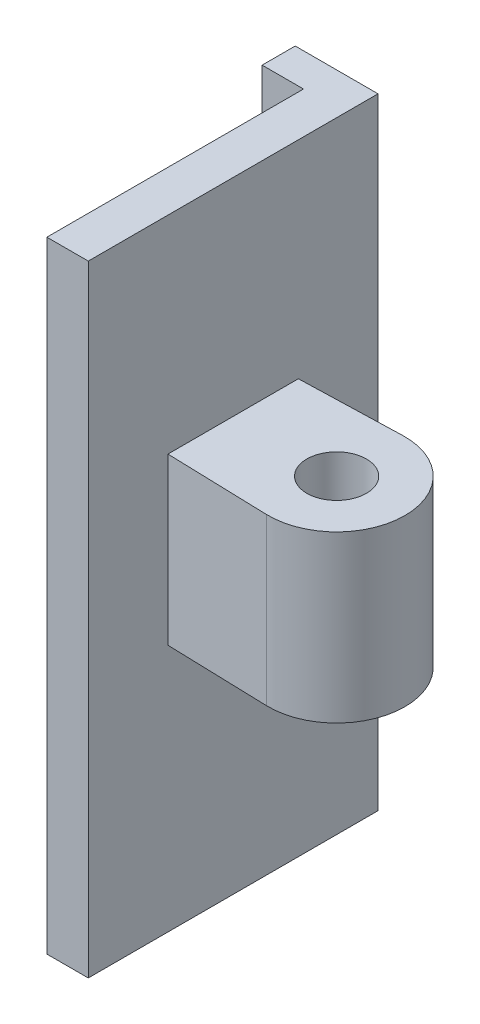
ISO-10303-21;
HEADER;
FILE_DESCRIPTION(('STEP AP214'),'2;1');
FILE_NAME('part.step','',(''),(''),'','','');
FILE_SCHEMA(('AUTOMOTIVE_DESIGN { 1 0 10303 214 1 1 1 1 }'));
ENDSEC;
DATA;
#1=APPLICATION_CONTEXT('core data for automotive mechanical design processes');
#2=APPLICATION_PROTOCOL_DEFINITION('international standard','automotive_design',2000,#1);
#3=PRODUCT_CONTEXT('',#1,'mechanical');
#4=PRODUCT('Part','Part','',(#3));
#5=PRODUCT_RELATED_PRODUCT_CATEGORY('part','',(#4));
#6=PRODUCT_DEFINITION_FORMATION('','',#4);
#7=PRODUCT_DEFINITION_CONTEXT('part definition',#1,'design');
#8=PRODUCT_DEFINITION('design','',#6,#7);
#9=PRODUCT_DEFINITION_SHAPE('','',#8);
#10=(LENGTH_UNIT() NAMED_UNIT(*) SI_UNIT(.MILLI.,.METRE.));
#11=(NAMED_UNIT(*) PLANE_ANGLE_UNIT() SI_UNIT($,.RADIAN.));
#12=(NAMED_UNIT(*) SI_UNIT($,.STERADIAN.) SOLID_ANGLE_UNIT());
#13=UNCERTAINTY_MEASURE_WITH_UNIT(LENGTH_MEASURE(1.E-05),#10,'distance_accuracy_value','');
#14=(GEOMETRIC_REPRESENTATION_CONTEXT(3) GLOBAL_UNCERTAINTY_ASSIGNED_CONTEXT((#13)) GLOBAL_UNIT_ASSIGNED_CONTEXT((#10,
#11,#12)) REPRESENTATION_CONTEXT('',''));
#15=CARTESIAN_POINT('',(0.,0.,0.));
#16=DIRECTION('',(0.,0.,1.));
#17=DIRECTION('',(1.,0.,0.));
#18=AXIS2_PLACEMENT_3D('',#15,#16,#17);
#19=CARTESIAN_POINT('',(2.5,-8.25,0.));
#20=DIRECTION('',(0.,-1.,0.));
#21=DIRECTION('',(0.,0.,-1.));
#22=AXIS2_PLACEMENT_3D('',#19,#20,#21);
#23=CYLINDRICAL_SURFACE('',#22,0.36);
#24=CARTESIAN_POINT('',(2.5,-8.25,0.));
#25=DIRECTION('',(0.,1.,0.));
#26=DIRECTION('',(0.,0.,1.));
#27=AXIS2_PLACEMENT_3D('',#24,#25,#26);
#28=CIRCLE('',#27,0.36);
#29=CARTESIAN_POINT('',(2.5,-8.25,0.360000000000001));
#30=VERTEX_POINT('',#29);
#31=EDGE_CURVE('E184',#30,#30,#28,.T.);
#32=ORIENTED_EDGE('',*,*,#31,.T.);
#33=EDGE_LOOP('',(#32));
#34=FACE_BOUND('',#33,.T.);
#35=CARTESIAN_POINT('',(2.5,-9.65,0.));
#36=DIRECTION('',(0.,-1.,0.));
#37=DIRECTION('',(0.,0.,-1.));
#38=AXIS2_PLACEMENT_3D('',#35,#36,#37);
#39=CIRCLE('',#38,0.36);
#40=CARTESIAN_POINT('',(2.5,-9.65,-0.359999999999999));
#41=VERTEX_POINT('',#40);
#42=EDGE_CURVE('E43',#41,#41,#39,.T.);
#43=ORIENTED_EDGE('',*,*,#42,.T.);
#44=EDGE_LOOP('',(#43));
#45=FACE_BOUND('',#44,.T.);
#46=ADVANCED_FACE('F39',(#34,#45),#23,.F.);
#47=CARTESIAN_POINT('',(0.750000000000001,-8.25,1.75));
#48=DIRECTION('',(1.,0.,0.));
#49=DIRECTION('',(0.,0.,-1.));
#50=AXIS2_PLACEMENT_3D('',#47,#48,#49);
#51=PLANE('',#50);
#52=DIRECTION('',(0.,1.,0.));
#53=VECTOR('',#52,1.);
#54=CARTESIAN_POINT('',(0.750000000000001,-5.75,-1.35));
#55=LINE('',#54,#53);
#56=CARTESIAN_POINT('',(0.750000000000001,-13.25,-1.35));
#57=VERTEX_POINT('',#56);
#58=CARTESIAN_POINT('',(0.750000000000001,-5.75,-1.35));
#59=VERTEX_POINT('',#58);
#60=EDGE_CURVE('E55',#57,#59,#55,.T.);
#61=ORIENTED_EDGE('',*,*,#60,.F.);
#62=DIRECTION('',(0.,0.,1.));
#63=VECTOR('',#62,1.);
#64=CARTESIAN_POINT('',(0.750000000000001,-13.25,-1.75));
#65=LINE('',#64,#63);
#66=CARTESIAN_POINT('',(0.750000000000001,-13.25,1.75));
#67=VERTEX_POINT('',#66);
#68=EDGE_CURVE('E169',#57,#67,#65,.T.);
#69=ORIENTED_EDGE('',*,*,#68,.T.);
#70=DIRECTION('',(0.,-1.,0.));
#71=VECTOR('',#70,1.);
#72=CARTESIAN_POINT('',(0.750000000000001,-8.25,1.75));
#73=LINE('',#72,#71);
#74=CARTESIAN_POINT('',(0.750000000000001,-5.75,1.75));
#75=VERTEX_POINT('',#74);
#76=EDGE_CURVE('E204',#75,#67,#73,.T.);
#77=ORIENTED_EDGE('',*,*,#76,.F.);
#78=DIRECTION('',(0.,0.,1.));
#79=VECTOR('',#78,1.);
#80=CARTESIAN_POINT('',(0.750000000000001,-5.75,-1.75));
#81=LINE('',#80,#79);
#82=EDGE_CURVE('E164',#59,#75,#81,.T.);
#83=ORIENTED_EDGE('',*,*,#82,.F.);
#84=EDGE_LOOP('',(#61,#69,#77,#83));
#85=FACE_BOUND('',#84,.T.);
#86=ADVANCED_FACE('F235',(#85),#51,.F.);
#87=CARTESIAN_POINT('',(2.5,-8.25,0.));
#88=DIRECTION('',(0.,1.,0.));
#89=DIRECTION('',(0.,0.,1.));
#90=AXIS2_PLACEMENT_3D('',#87,#88,#89);
#91=PLANE('',#90);
#92=DIRECTION('',(0.,0.,-1.));
#93=VECTOR('',#92,1.);
#94=CARTESIAN_POINT('',(1.25,-8.25,0.));
#95=LINE('',#94,#93);
#96=CARTESIAN_POINT('',(1.25,-8.25,0.78768744273324));
#97=VERTEX_POINT('',#96);
#98=CARTESIAN_POINT('',(1.25,-8.25,-0.787687442733241));
#99=VERTEX_POINT('',#98);
#100=EDGE_CURVE('E181',#97,#99,#95,.T.);
#101=ORIENTED_EDGE('',*,*,#100,.F.);
#102=DIRECTION('',(0.99954579976556,0.,0.0301362600703332));
#103=VECTOR('',#102,1.);
#104=CARTESIAN_POINT('',(2.47513758544198,-8.25,0.824625284806589));
#105=LINE('',#104,#103);
#106=CARTESIAN_POINT('',(2.47513758544198,-8.25,0.824625284806589));
#107=VERTEX_POINT('',#106);
#108=EDGE_CURVE('E64',#97,#107,#105,.T.);
#109=ORIENTED_EDGE('',*,*,#108,.T.);
#110=CARTESIAN_POINT('',(2.5,-8.25,0.));
#111=DIRECTION('',(0.,1.,0.));
#112=DIRECTION('',(0.,0.,1.));
#113=AXIS2_PLACEMENT_3D('',#110,#111,#112);
#114=CIRCLE('',#113,0.825000000000001);
#115=CARTESIAN_POINT('',(2.47513758544198,-8.25,-0.824625284806588));
#116=VERTEX_POINT('',#115);
#117=EDGE_CURVE('E188',#107,#116,#114,.T.);
#118=ORIENTED_EDGE('',*,*,#117,.T.);
#119=DIRECTION('',(-0.99954579976556,0.,0.0301362600703313));
#120=VECTOR('',#119,1.);
#121=CARTESIAN_POINT('',(1.25,-8.25,-0.787687442733241));
#122=LINE('',#121,#120);
#123=EDGE_CURVE('E86',#116,#99,#122,.T.);
#124=ORIENTED_EDGE('',*,*,#123,.T.);
#125=EDGE_LOOP('',(#101,#109,#118,#124));
#126=FACE_BOUND('',#125,.T.);
#127=ORIENTED_EDGE('',*,*,#31,.F.);
#128=EDGE_LOOP('',(#127));
#129=FACE_BOUND('',#128,.T.);
#130=ADVANCED_FACE('F243',(#126,#129),#91,.T.);
#131=CARTESIAN_POINT('',(2.5,-10.25,0.));
#132=DIRECTION('',(0.,1.,0.));
#133=DIRECTION('',(0.,0.,1.));
#134=AXIS2_PLACEMENT_3D('',#131,#132,#133);
#135=PLANE('',#134);
#136=CARTESIAN_POINT('',(2.5,-10.25,0.));
#137=DIRECTION('',(0.,-1.,0.));
#138=DIRECTION('',(0.,0.,-1.));
#139=AXIS2_PLACEMENT_3D('',#136,#137,#138);
#140=CIRCLE('',#139,0.45);
#141=CARTESIAN_POINT('',(2.5,-10.25,-0.449999999999999));
#142=VERTEX_POINT('',#141);
#143=EDGE_CURVE('E155',#142,#142,#140,.T.);
#144=ORIENTED_EDGE('',*,*,#143,.F.);
#145=EDGE_LOOP('',(#144));
#146=FACE_BOUND('',#145,.T.);
#147=DIRECTION('',(0.99954579976556,0.,0.0301362600703332));
#148=VECTOR('',#147,1.);
#149=CARTESIAN_POINT('',(2.47513758544198,-10.25,0.824625284806589));
#150=LINE('',#149,#148);
#151=CARTESIAN_POINT('',(1.25,-10.25,0.78768744273324));
#152=VERTEX_POINT('',#151);
#153=CARTESIAN_POINT('',(2.47513758544198,-10.25,0.824625284806589));
#154=VERTEX_POINT('',#153);
#155=EDGE_CURVE('E79',#152,#154,#150,.T.);
#156=ORIENTED_EDGE('',*,*,#155,.F.);
#157=DIRECTION('',(0.,0.,-1.));
#158=VECTOR('',#157,1.);
#159=CARTESIAN_POINT('',(1.25,-10.25,0.));
#160=LINE('',#159,#158);
#161=CARTESIAN_POINT('',(1.25,-10.25,-0.787687442733241));
#162=VERTEX_POINT('',#161);
#163=EDGE_CURVE('E179',#152,#162,#160,.T.);
#164=ORIENTED_EDGE('',*,*,#163,.T.);
#165=DIRECTION('',(-0.99954579976556,0.,0.0301362600703313));
#166=VECTOR('',#165,1.);
#167=CARTESIAN_POINT('',(1.25,-10.25,-0.787687442733241));
#168=LINE('',#167,#166);
#169=CARTESIAN_POINT('',(2.47513758544198,-10.25,-0.824625284806588));
#170=VERTEX_POINT('',#169);
#171=EDGE_CURVE('E195',#170,#162,#168,.T.);
#172=ORIENTED_EDGE('',*,*,#171,.F.);
#173=CARTESIAN_POINT('',(2.5,-10.25,0.));
#174=DIRECTION('',(0.,1.,0.));
#175=DIRECTION('',(0.,0.,1.));
#176=AXIS2_PLACEMENT_3D('',#173,#174,#175);
#177=CIRCLE('',#176,0.825000000000001);
#178=EDGE_CURVE('E187',#154,#170,#177,.T.);
#179=ORIENTED_EDGE('',*,*,#178,.F.);
#180=EDGE_LOOP('',(#156,#164,#172,#179));
#181=FACE_BOUND('',#180,.T.);
#182=ADVANCED_FACE('F217',(#146,#181),#135,.F.);
#183=CARTESIAN_POINT('',(2.5,-8.25,0.));
#184=DIRECTION('',(0.,-1.,0.));
#185=DIRECTION('',(0.,0.,-1.));
#186=AXIS2_PLACEMENT_3D('',#183,#184,#185);
#187=CYLINDRICAL_SURFACE('',#186,0.825000000000001);
#188=ORIENTED_EDGE('',*,*,#178,.T.);
#189=DIRECTION('',(0.,-1.,0.));
#190=VECTOR('',#189,1.);
#191=CARTESIAN_POINT('',(2.47513758544198,-8.25,-0.824625284806588));
#192=LINE('',#191,#190);
#193=EDGE_CURVE('E11',#116,#170,#192,.T.);
#194=ORIENTED_EDGE('',*,*,#193,.F.);
#195=ORIENTED_EDGE('',*,*,#117,.F.);
#196=DIRECTION('',(0.,-1.,0.));
#197=VECTOR('',#196,1.);
#198=CARTESIAN_POINT('',(2.47513758544198,-8.25,0.824625284806589));
#199=LINE('',#198,#197);
#200=EDGE_CURVE('E192',#107,#154,#199,.T.);
#201=ORIENTED_EDGE('',*,*,#200,.T.);
#202=EDGE_LOOP('',(#188,#194,#195,#201));
#203=FACE_BOUND('',#202,.T.);
#204=ADVANCED_FACE('F41',(#203),#187,.T.);
#205=CARTESIAN_POINT('',(1.25,-8.25,-0.787687442733241));
#206=DIRECTION('',(0.0301362600703313,0.,0.99954579976556));
#207=DIRECTION('',(0.99954579976556,0.,-0.0301362600703313));
#208=AXIS2_PLACEMENT_3D('',#205,#206,#207);
#209=PLANE('',#208);
#210=ORIENTED_EDGE('',*,*,#171,.T.);
#211=DIRECTION('',(0.,-1.,0.));
#212=VECTOR('',#211,1.);
#213=CARTESIAN_POINT('',(1.25,-8.25,-0.787687442733241));
#214=LINE('',#213,#212);
#215=EDGE_CURVE('E48',#99,#162,#214,.T.);
#216=ORIENTED_EDGE('',*,*,#215,.F.);
#217=ORIENTED_EDGE('',*,*,#123,.F.);
#218=ORIENTED_EDGE('',*,*,#193,.T.);
#219=EDGE_LOOP('',(#210,#216,#217,#218));
#220=FACE_BOUND('',#219,.T.);
#221=ADVANCED_FACE('F213',(#220),#209,.F.);
#222=CARTESIAN_POINT('',(0.750000000000001,-8.25,-1.75));
#223=DIRECTION('',(0.,0.,1.));
#224=DIRECTION('',(1.,0.,0.));
#225=AXIS2_PLACEMENT_3D('',#222,#223,#224);
#226=PLANE('',#225);
#227=DIRECTION('',(0.,-1.,0.));
#228=VECTOR('',#227,1.);
#229=CARTESIAN_POINT('',(1.25,-8.25,-1.75));
#230=LINE('',#229,#228);
#231=CARTESIAN_POINT('',(1.25,-5.75,-1.75));
#232=VERTEX_POINT('',#231);
#233=CARTESIAN_POINT('',(1.25,-13.25,-1.75));
#234=VERTEX_POINT('',#233);
#235=EDGE_CURVE('E132',#232,#234,#230,.T.);
#236=ORIENTED_EDGE('',*,*,#235,.T.);
#237=DIRECTION('',(-1.,0.,0.));
#238=VECTOR('',#237,1.);
#239=CARTESIAN_POINT('',(1.25,-13.25,-1.75));
#240=LINE('',#239,#238);
#241=CARTESIAN_POINT('',(0.250000000000001,-13.25,-1.75));
#242=VERTEX_POINT('',#241);
#243=EDGE_CURVE('E126',#234,#242,#240,.T.);
#244=ORIENTED_EDGE('',*,*,#243,.T.);
#245=DIRECTION('',(0.,-1.,0.));
#246=VECTOR('',#245,1.);
#247=CARTESIAN_POINT('',(0.250000000000001,-5.75,-1.75));
#248=LINE('',#247,#246);
#249=CARTESIAN_POINT('',(0.250000000000001,-5.75,-1.75));
#250=VERTEX_POINT('',#249);
#251=EDGE_CURVE('E131',#250,#242,#248,.T.);
#252=ORIENTED_EDGE('',*,*,#251,.F.);
#253=DIRECTION('',(-1.,0.,0.));
#254=VECTOR('',#253,1.);
#255=CARTESIAN_POINT('',(1.25,-5.75,-1.75));
#256=LINE('',#255,#254);
#257=EDGE_CURVE('E137',#232,#250,#256,.T.);
#258=ORIENTED_EDGE('',*,*,#257,.F.);
#259=EDGE_LOOP('',(#236,#244,#252,#258));
#260=FACE_BOUND('',#259,.T.);
#261=ADVANCED_FACE('F128',(#260),#226,.F.);
#262=CARTESIAN_POINT('',(1.25,-8.25,1.75));
#263=DIRECTION('',(0.,0.,-1.));
#264=DIRECTION('',(-1.,0.,0.));
#265=AXIS2_PLACEMENT_3D('',#262,#263,#264);
#266=PLANE('',#265);
#267=ORIENTED_EDGE('',*,*,#76,.T.);
#268=DIRECTION('',(-1.,0.,0.));
#269=VECTOR('',#268,1.);
#270=CARTESIAN_POINT('',(1.25,-13.25,1.75));
#271=LINE('',#270,#269);
#272=CARTESIAN_POINT('',(1.25,-13.25,1.75));
#273=VERTEX_POINT('',#272);
#274=EDGE_CURVE('E136',#273,#67,#271,.T.);
#275=ORIENTED_EDGE('',*,*,#274,.F.);
#276=DIRECTION('',(0.,-1.,0.));
#277=VECTOR('',#276,1.);
#278=CARTESIAN_POINT('',(1.25,-8.25,1.75));
#279=LINE('',#278,#277);
#280=CARTESIAN_POINT('',(1.25,-5.75,1.75));
#281=VERTEX_POINT('',#280);
#282=EDGE_CURVE('E202',#281,#273,#279,.T.);
#283=ORIENTED_EDGE('',*,*,#282,.F.);
#284=DIRECTION('',(-1.,0.,0.));
#285=VECTOR('',#284,1.);
#286=CARTESIAN_POINT('',(1.25,-5.75,1.75));
#287=LINE('',#286,#285);
#288=EDGE_CURVE('E176',#281,#75,#287,.T.);
#289=ORIENTED_EDGE('',*,*,#288,.T.);
#290=EDGE_LOOP('',(#267,#275,#283,#289));
#291=FACE_BOUND('',#290,.T.);
#292=ADVANCED_FACE('F231',(#291),#266,.F.);
#293=CARTESIAN_POINT('',(1.25,-8.25,0.78768744273324));
#294=DIRECTION('',(-1.,0.,0.));
#295=DIRECTION('',(0.,0.,1.));
#296=AXIS2_PLACEMENT_3D('',#293,#294,#295);
#297=PLANE('',#296);
#298=DIRECTION('',(0.,-1.,0.));
#299=VECTOR('',#298,1.);
#300=CARTESIAN_POINT('',(1.25,-8.25,0.78768744273324));
#301=LINE('',#300,#299);
#302=EDGE_CURVE('E200',#97,#152,#301,.T.);
#303=ORIENTED_EDGE('',*,*,#302,.F.);
#304=ORIENTED_EDGE('',*,*,#100,.T.);
#305=ORIENTED_EDGE('',*,*,#215,.T.);
#306=ORIENTED_EDGE('',*,*,#163,.F.);
#307=EDGE_LOOP('',(#303,#304,#305,#306));
#308=FACE_BOUND('',#307,.T.);
#309=ORIENTED_EDGE('',*,*,#282,.T.);
#310=DIRECTION('',(0.,0.,1.));
#311=VECTOR('',#310,1.);
#312=CARTESIAN_POINT('',(1.25,-13.25,-1.75));
#313=LINE('',#312,#311);
#314=EDGE_CURVE('E168',#234,#273,#313,.T.);
#315=ORIENTED_EDGE('',*,*,#314,.F.);
#316=ORIENTED_EDGE('',*,*,#235,.F.);
#317=DIRECTION('',(0.,0.,1.));
#318=VECTOR('',#317,1.);
#319=CARTESIAN_POINT('',(1.25,-5.75,-1.75));
#320=LINE('',#319,#318);
#321=EDGE_CURVE('E165',#232,#281,#320,.T.);
#322=ORIENTED_EDGE('',*,*,#321,.T.);
#323=EDGE_LOOP('',(#309,#315,#316,#322));
#324=FACE_BOUND('',#323,.T.);
#325=ADVANCED_FACE('F211',(#308,#324),#297,.F.);
#326=CARTESIAN_POINT('',(2.47513758544198,-8.25,0.824625284806589));
#327=DIRECTION('',(0.0301362600703332,0.,-0.99954579976556));
#328=DIRECTION('',(-0.99954579976556,0.,-0.0301362600703332));
#329=AXIS2_PLACEMENT_3D('',#326,#327,#328);
#330=PLANE('',#329);
#331=ORIENTED_EDGE('',*,*,#155,.T.);
#332=ORIENTED_EDGE('',*,*,#200,.F.);
#333=ORIENTED_EDGE('',*,*,#108,.F.);
#334=ORIENTED_EDGE('',*,*,#302,.T.);
#335=EDGE_LOOP('',(#331,#332,#333,#334));
#336=FACE_BOUND('',#335,.T.);
#337=ADVANCED_FACE('F220',(#336),#330,.F.);
#338=CARTESIAN_POINT('',(1.25,-13.25,-1.75));
#339=DIRECTION('',(0.,-1.,0.));
#340=DIRECTION('',(1.,0.,0.));
#341=AXIS2_PLACEMENT_3D('',#338,#339,#340);
#342=PLANE('',#341);
#343=ORIENTED_EDGE('',*,*,#68,.F.);
#344=DIRECTION('',(1.,0.,0.));
#345=VECTOR('',#344,1.);
#346=CARTESIAN_POINT('',(0.250000000000001,-13.25,-1.35));
#347=LINE('',#346,#345);
#348=CARTESIAN_POINT('',(0.250000000000001,-13.25,-1.35));
#349=VERTEX_POINT('',#348);
#350=EDGE_CURVE('E143',#349,#57,#347,.T.);
#351=ORIENTED_EDGE('',*,*,#350,.F.);
#352=DIRECTION('',(0.,0.,1.));
#353=VECTOR('',#352,1.);
#354=CARTESIAN_POINT('',(0.250000000000001,-13.25,-1.75));
#355=LINE('',#354,#353);
#356=EDGE_CURVE('E140',#242,#349,#355,.T.);
#357=ORIENTED_EDGE('',*,*,#356,.F.);
#358=ORIENTED_EDGE('',*,*,#243,.F.);
#359=ORIENTED_EDGE('',*,*,#314,.T.);
#360=ORIENTED_EDGE('',*,*,#274,.T.);
#361=EDGE_LOOP('',(#343,#351,#357,#358,#359,#360));
#362=FACE_BOUND('',#361,.T.);
#363=ADVANCED_FACE('F141',(#362),#342,.T.);
#364=CARTESIAN_POINT('',(1.25,-5.75,-1.75));
#365=DIRECTION('',(0.,-1.,0.));
#366=DIRECTION('',(1.,0.,0.));
#367=AXIS2_PLACEMENT_3D('',#364,#365,#366);
#368=PLANE('',#367);
#369=ORIENTED_EDGE('',*,*,#257,.T.);
#370=DIRECTION('',(0.,0.,-1.));
#371=VECTOR('',#370,1.);
#372=CARTESIAN_POINT('',(0.250000000000001,-5.75,-1.75));
#373=LINE('',#372,#371);
#374=CARTESIAN_POINT('',(0.250000000000001,-5.75,-1.35));
#375=VERTEX_POINT('',#374);
#376=EDGE_CURVE('E151',#375,#250,#373,.T.);
#377=ORIENTED_EDGE('',*,*,#376,.F.);
#378=DIRECTION('',(1.,0.,0.));
#379=VECTOR('',#378,1.);
#380=CARTESIAN_POINT('',(0.250000000000001,-5.75,-1.35));
#381=LINE('',#380,#379);
#382=EDGE_CURVE('E159',#375,#59,#381,.T.);
#383=ORIENTED_EDGE('',*,*,#382,.T.);
#384=ORIENTED_EDGE('',*,*,#82,.T.);
#385=ORIENTED_EDGE('',*,*,#288,.F.);
#386=ORIENTED_EDGE('',*,*,#321,.F.);
#387=EDGE_LOOP('',(#369,#377,#383,#384,#385,#386));
#388=FACE_BOUND('',#387,.T.);
#389=ADVANCED_FACE('F229',(#388),#368,.F.);
#390=CARTESIAN_POINT('',(0.250000000000001,-5.75,-1.35));
#391=DIRECTION('',(0.,0.,-1.));
#392=DIRECTION('',(0.,1.,0.));
#393=AXIS2_PLACEMENT_3D('',#390,#391,#392);
#394=PLANE('',#393);
#395=ORIENTED_EDGE('',*,*,#60,.T.);
#396=ORIENTED_EDGE('',*,*,#382,.F.);
#397=DIRECTION('',(0.,1.,0.));
#398=VECTOR('',#397,1.);
#399=CARTESIAN_POINT('',(0.250000000000001,-5.75,-1.35));
#400=LINE('',#399,#398);
#401=EDGE_CURVE('E146',#349,#375,#400,.T.);
#402=ORIENTED_EDGE('',*,*,#401,.F.);
#403=ORIENTED_EDGE('',*,*,#350,.T.);
#404=EDGE_LOOP('',(#395,#396,#402,#403));
#405=FACE_BOUND('',#404,.T.);
#406=ADVANCED_FACE('F278',(#405),#394,.F.);
#407=CARTESIAN_POINT('',(0.250000000000001,0.,0.));
#408=DIRECTION('',(-1.,0.,0.));
#409=DIRECTION('',(0.,0.,1.));
#410=AXIS2_PLACEMENT_3D('',#407,#408,#409);
#411=PLANE('',#410);
#412=ORIENTED_EDGE('',*,*,#251,.T.);
#413=ORIENTED_EDGE('',*,*,#356,.T.);
#414=ORIENTED_EDGE('',*,*,#401,.T.);
#415=ORIENTED_EDGE('',*,*,#376,.T.);
#416=EDGE_LOOP('',(#412,#413,#414,#415));
#417=FACE_BOUND('',#416,.T.);
#418=ADVANCED_FACE('F149',(#417),#411,.T.);
#419=CARTESIAN_POINT('',(2.5,-9.65,0.));
#420=DIRECTION('',(0.,-1.,0.));
#421=DIRECTION('',(0.,0.,-1.));
#422=AXIS2_PLACEMENT_3D('',#419,#420,#421);
#423=CYLINDRICAL_SURFACE('',#422,0.45);
#424=CARTESIAN_POINT('',(2.5,-9.65,0.));
#425=DIRECTION('',(0.,-1.,0.));
#426=DIRECTION('',(0.,0.,-1.));
#427=AXIS2_PLACEMENT_3D('',#424,#425,#426);
#428=CIRCLE('',#427,0.45);
#429=CARTESIAN_POINT('',(2.5,-9.65,-0.449999999999999));
#430=VERTEX_POINT('',#429);
#431=EDGE_CURVE('E258',#430,#430,#428,.T.);
#432=ORIENTED_EDGE('',*,*,#431,.F.);
#433=EDGE_LOOP('',(#432));
#434=FACE_BOUND('',#433,.T.);
#435=ORIENTED_EDGE('',*,*,#143,.T.);
#436=EDGE_LOOP('',(#435));
#437=FACE_BOUND('',#436,.T.);
#438=ADVANCED_FACE('F267',(#434,#437),#423,.F.);
#439=CARTESIAN_POINT('',(2.5,-9.65,0.));
#440=DIRECTION('',(0.,-1.,0.));
#441=DIRECTION('',(0.,0.,-1.));
#442=AXIS2_PLACEMENT_3D('',#439,#440,#441);
#443=PLANE('',#442);
#444=ORIENTED_EDGE('',*,*,#42,.F.);
#445=EDGE_LOOP('',(#444));
#446=FACE_BOUND('',#445,.T.);
#447=ORIENTED_EDGE('',*,*,#431,.T.);
#448=EDGE_LOOP('',(#447));
#449=FACE_BOUND('',#448,.T.);
#450=ADVANCED_FACE('F265',(#446,#449),#443,.T.);
#451=CLOSED_SHELL('',(#46,#86,#130,#182,#204,#221,#261,#292,#325,#337,#363,#389,#406,#418,#438,#450));
#452=MANIFOLD_SOLID_BREP('B2',#451);
#453=ADVANCED_BREP_SHAPE_REPRESENTATION('',(#18,#452),#14);
#454=SHAPE_DEFINITION_REPRESENTATION(#9,#453);
ENDSEC;
END-ISO-10303-21;
